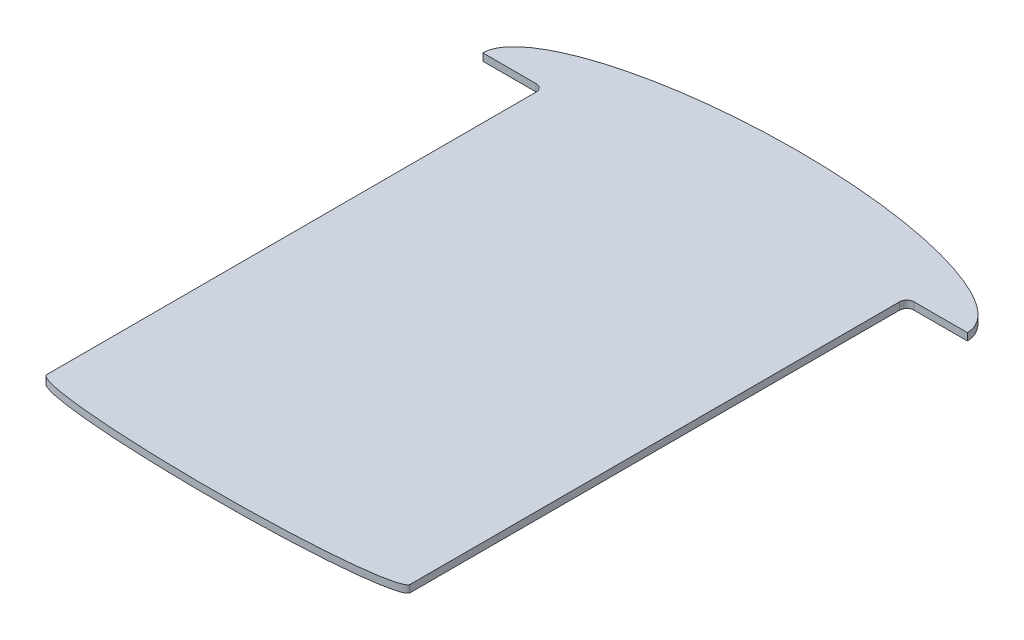
ISO-10303-21;
HEADER;
FILE_DESCRIPTION(('STEP AP214'),'2;1');
FILE_NAME('part.step','',(''),(''),'','','');
FILE_SCHEMA(('AUTOMOTIVE_DESIGN { 1 0 10303 214 1 1 1 1 }'));
ENDSEC;
DATA;
#1=APPLICATION_CONTEXT('core data for automotive mechanical design processes');
#2=APPLICATION_PROTOCOL_DEFINITION('international standard','automotive_design',2000,#1);
#3=PRODUCT_CONTEXT('',#1,'mechanical');
#4=PRODUCT('Part','Part','',(#3));
#5=PRODUCT_RELATED_PRODUCT_CATEGORY('part','',(#4));
#6=PRODUCT_DEFINITION_FORMATION('','',#4);
#7=PRODUCT_DEFINITION_CONTEXT('part definition',#1,'design');
#8=PRODUCT_DEFINITION('design','',#6,#7);
#9=PRODUCT_DEFINITION_SHAPE('','',#8);
#10=(LENGTH_UNIT() NAMED_UNIT(*) SI_UNIT(.MILLI.,.METRE.));
#11=(NAMED_UNIT(*) PLANE_ANGLE_UNIT() SI_UNIT($,.RADIAN.));
#12=(NAMED_UNIT(*) SI_UNIT($,.STERADIAN.) SOLID_ANGLE_UNIT());
#13=UNCERTAINTY_MEASURE_WITH_UNIT(LENGTH_MEASURE(1.E-05),#10,'distance_accuracy_value','');
#14=(GEOMETRIC_REPRESENTATION_CONTEXT(3) GLOBAL_UNCERTAINTY_ASSIGNED_CONTEXT((#13)) GLOBAL_UNIT_ASSIGNED_CONTEXT((#10,
#11,#12)) REPRESENTATION_CONTEXT('',''));
#15=CARTESIAN_POINT('',(0.,0.,0.));
#16=DIRECTION('',(0.,0.,1.));
#17=DIRECTION('',(1.,0.,0.));
#18=AXIS2_PLACEMENT_3D('',#15,#16,#17);
#19=CARTESIAN_POINT('',(-75.,3.,0.));
#20=DIRECTION('',(1.,0.,0.));
#21=DIRECTION('',(0.,0.,-1.));
#22=AXIS2_PLACEMENT_3D('',#19,#20,#21);
#23=PLANE('',#22);
#24=DIRECTION('',(0.,0.,1.));
#25=VECTOR('',#24,1.);
#26=CARTESIAN_POINT('',(-75.,3.,0.));
#27=LINE('',#26,#25);
#28=CARTESIAN_POINT('',(-75.,3.,-92.));
#29=VERTEX_POINT('',#28);
#30=CARTESIAN_POINT('',(-75.,3.,110.));
#31=VERTEX_POINT('',#30);
#32=EDGE_CURVE('E102',#29,#31,#27,.T.);
#33=ORIENTED_EDGE('',*,*,#32,.F.);
#34=DIRECTION('',(0.,-1.,0.));
#35=VECTOR('',#34,1.);
#36=CARTESIAN_POINT('',(-75.,0.,-92.));
#37=LINE('',#36,#35);
#38=CARTESIAN_POINT('',(-75.,0.,-92.));
#39=VERTEX_POINT('',#38);
#40=EDGE_CURVE('E136',#29,#39,#37,.T.);
#41=ORIENTED_EDGE('',*,*,#40,.T.);
#42=DIRECTION('',(0.,0.,1.));
#43=VECTOR('',#42,1.);
#44=CARTESIAN_POINT('',(-75.,0.,0.));
#45=LINE('',#44,#43);
#46=CARTESIAN_POINT('',(-75.,0.,110.));
#47=VERTEX_POINT('',#46);
#48=EDGE_CURVE('E124',#39,#47,#45,.T.);
#49=ORIENTED_EDGE('',*,*,#48,.T.);
#50=DIRECTION('',(0.,-1.,0.));
#51=VECTOR('',#50,1.);
#52=CARTESIAN_POINT('',(-75.,3.,110.));
#53=LINE('',#52,#51);
#54=EDGE_CURVE('E119',#31,#47,#53,.T.);
#55=ORIENTED_EDGE('',*,*,#54,.F.);
#56=EDGE_LOOP('',(#33,#41,#49,#55));
#57=FACE_BOUND('',#56,.T.);
#58=ADVANCED_FACE('F37',(#57),#23,.F.);
#59=CARTESIAN_POINT('',(0.,3.,110.));
#60=DIRECTION('',(0.,1.,0.));
#61=DIRECTION('',(1.,0.,0.));
#62=AXIS2_PLACEMENT_3D('',#59,#60,#61);
#63=ELLIPSE('',#62,75.,7.01096901654884);
#64=DIRECTION('',(0.,-1.,0.));
#65=VECTOR('',#64,1.);
#66=SURFACE_OF_LINEAR_EXTRUSION('',#63,#65);
#67=CARTESIAN_POINT('',(0.,0.,110.));
#68=DIRECTION('',(0.,1.,0.));
#69=DIRECTION('',(1.,0.,0.));
#70=AXIS2_PLACEMENT_3D('',#67,#68,#69);
#71=ELLIPSE('',#70,75.,7.01096901654884);
#72=CARTESIAN_POINT('',(75.,0.,110.));
#73=VERTEX_POINT('',#72);
#74=EDGE_CURVE('E164',#47,#73,#71,.T.);
#75=ORIENTED_EDGE('',*,*,#74,.T.);
#76=DIRECTION('',(0.,-1.,0.));
#77=VECTOR('',#76,1.);
#78=CARTESIAN_POINT('',(75.,3.,110.));
#79=LINE('',#78,#77);
#80=CARTESIAN_POINT('',(75.,3.,110.));
#81=VERTEX_POINT('',#80);
#82=EDGE_CURVE('E121',#81,#73,#79,.T.);
#83=ORIENTED_EDGE('',*,*,#82,.F.);
#84=EDGE_CURVE('E106',#31,#81,#63,.T.);
#85=ORIENTED_EDGE('',*,*,#84,.F.);
#86=ORIENTED_EDGE('',*,*,#54,.T.);
#87=EDGE_LOOP('',(#75,#83,#85,#86));
#88=FACE_BOUND('',#87,.T.);
#89=ADVANCED_FACE('F118',(#88),#66,.F.);
#90=CARTESIAN_POINT('',(75.,3.,0.));
#91=DIRECTION('',(1.,0.,0.));
#92=DIRECTION('',(0.,0.,-1.));
#93=AXIS2_PLACEMENT_3D('',#90,#91,#92);
#94=PLANE('',#93);
#95=DIRECTION('',(0.,0.,1.));
#96=VECTOR('',#95,1.);
#97=CARTESIAN_POINT('',(75.,0.,0.));
#98=LINE('',#97,#96);
#99=CARTESIAN_POINT('',(75.,0.,-92.));
#100=VERTEX_POINT('',#99);
#101=EDGE_CURVE('E159',#100,#73,#98,.T.);
#102=ORIENTED_EDGE('',*,*,#101,.F.);
#103=DIRECTION('',(0.,-1.,0.));
#104=VECTOR('',#103,1.);
#105=CARTESIAN_POINT('',(75.,3.,-92.));
#106=LINE('',#105,#104);
#107=CARTESIAN_POINT('',(75.,3.,-92.));
#108=VERTEX_POINT('',#107);
#109=EDGE_CURVE('E129',#100,#108,#106,.F.);
#110=ORIENTED_EDGE('',*,*,#109,.T.);
#111=DIRECTION('',(0.,0.,1.));
#112=VECTOR('',#111,1.);
#113=CARTESIAN_POINT('',(75.,3.,0.));
#114=LINE('',#113,#112);
#115=EDGE_CURVE('E122',#108,#81,#114,.T.);
#116=ORIENTED_EDGE('',*,*,#115,.T.);
#117=ORIENTED_EDGE('',*,*,#82,.T.);
#118=EDGE_LOOP('',(#102,#110,#116,#117));
#119=FACE_BOUND('',#118,.T.);
#120=ADVANCED_FACE('F163',(#119),#94,.T.);
#121=CARTESIAN_POINT('',(0.,3.,-95.));
#122=DIRECTION('',(0.,0.,-1.));
#123=DIRECTION('',(-1.,0.,0.));
#124=AXIS2_PLACEMENT_3D('',#121,#122,#123);
#125=PLANE('',#124);
#126=DIRECTION('',(1.,0.,0.));
#127=VECTOR('',#126,1.);
#128=CARTESIAN_POINT('',(0.,3.,-95.));
#129=LINE('',#128,#127);
#130=CARTESIAN_POINT('',(78.,3.,-95.));
#131=VERTEX_POINT('',#130);
#132=CARTESIAN_POINT('',(100.,3.,-95.));
#133=VERTEX_POINT('',#132);
#134=EDGE_CURVE('E144',#131,#133,#129,.T.);
#135=ORIENTED_EDGE('',*,*,#134,.F.);
#136=DIRECTION('',(0.,-1.,0.));
#137=VECTOR('',#136,1.);
#138=CARTESIAN_POINT('',(78.,3.,-95.));
#139=LINE('',#138,#137);
#140=CARTESIAN_POINT('',(78.,0.,-95.));
#141=VERTEX_POINT('',#140);
#142=EDGE_CURVE('E126',#131,#141,#139,.T.);
#143=ORIENTED_EDGE('',*,*,#142,.T.);
#144=DIRECTION('',(1.,0.,0.));
#145=VECTOR('',#144,1.);
#146=CARTESIAN_POINT('',(0.,0.,-95.));
#147=LINE('',#146,#145);
#148=CARTESIAN_POINT('',(100.,0.,-95.));
#149=VERTEX_POINT('',#148);
#150=EDGE_CURVE('E161',#141,#149,#147,.T.);
#151=ORIENTED_EDGE('',*,*,#150,.T.);
#152=DIRECTION('',(0.,-1.,0.));
#153=VECTOR('',#152,1.);
#154=CARTESIAN_POINT('',(100.,3.,-95.));
#155=LINE('',#154,#153);
#156=EDGE_CURVE('E131',#133,#149,#155,.T.);
#157=ORIENTED_EDGE('',*,*,#156,.F.);
#158=EDGE_LOOP('',(#135,#143,#151,#157));
#159=FACE_BOUND('',#158,.T.);
#160=ADVANCED_FACE('F150',(#159),#125,.F.);
#161=CARTESIAN_POINT('',(0.,3.,-95.));
#162=DIRECTION('',(0.,1.,0.));
#163=DIRECTION('',(1.,0.,0.));
#164=AXIS2_PLACEMENT_3D('',#161,#162,#163);
#165=ELLIPSE('',#164,100.,30.);
#166=DIRECTION('',(0.,-1.,0.));
#167=VECTOR('',#166,1.);
#168=SURFACE_OF_LINEAR_EXTRUSION('',#165,#167);
#169=CARTESIAN_POINT('',(0.,0.,-95.));
#170=DIRECTION('',(0.,1.,0.));
#171=DIRECTION('',(1.,0.,0.));
#172=AXIS2_PLACEMENT_3D('',#169,#170,#171);
#173=ELLIPSE('',#172,100.,30.);
#174=CARTESIAN_POINT('',(-100.,0.,-95.));
#175=VERTEX_POINT('',#174);
#176=EDGE_CURVE('E166',#149,#175,#173,.T.);
#177=ORIENTED_EDGE('',*,*,#176,.T.);
#178=DIRECTION('',(0.,-1.,0.));
#179=VECTOR('',#178,1.);
#180=CARTESIAN_POINT('',(-100.,3.,-95.));
#181=LINE('',#180,#179);
#182=CARTESIAN_POINT('',(-100.,3.,-95.));
#183=VERTEX_POINT('',#182);
#184=EDGE_CURVE('E173',#183,#175,#181,.T.);
#185=ORIENTED_EDGE('',*,*,#184,.F.);
#186=EDGE_CURVE('E154',#133,#183,#165,.T.);
#187=ORIENTED_EDGE('',*,*,#186,.F.);
#188=ORIENTED_EDGE('',*,*,#156,.T.);
#189=EDGE_LOOP('',(#177,#185,#187,#188));
#190=FACE_BOUND('',#189,.T.);
#191=ADVANCED_FACE('F177',(#190),#168,.F.);
#192=CARTESIAN_POINT('',(0.,3.,-95.));
#193=DIRECTION('',(0.,0.,-1.));
#194=DIRECTION('',(-1.,0.,0.));
#195=AXIS2_PLACEMENT_3D('',#192,#193,#194);
#196=PLANE('',#195);
#197=DIRECTION('',(1.,0.,0.));
#198=VECTOR('',#197,1.);
#199=CARTESIAN_POINT('',(0.,0.,-95.));
#200=LINE('',#199,#198);
#201=CARTESIAN_POINT('',(-78.,0.,-95.));
#202=VERTEX_POINT('',#201);
#203=EDGE_CURVE('E113',#175,#202,#200,.T.);
#204=ORIENTED_EDGE('',*,*,#203,.T.);
#205=DIRECTION('',(0.,-1.,0.));
#206=VECTOR('',#205,1.);
#207=CARTESIAN_POINT('',(-78.,3.,-95.));
#208=LINE('',#207,#206);
#209=CARTESIAN_POINT('',(-78.,3.,-95.));
#210=VERTEX_POINT('',#209);
#211=EDGE_CURVE('E52',#202,#210,#208,.F.);
#212=ORIENTED_EDGE('',*,*,#211,.T.);
#213=DIRECTION('',(1.,0.,0.));
#214=VECTOR('',#213,1.);
#215=CARTESIAN_POINT('',(0.,3.,-95.));
#216=LINE('',#215,#214);
#217=EDGE_CURVE('E175',#183,#210,#216,.T.);
#218=ORIENTED_EDGE('',*,*,#217,.F.);
#219=ORIENTED_EDGE('',*,*,#184,.T.);
#220=EDGE_LOOP('',(#204,#212,#218,#219));
#221=FACE_BOUND('',#220,.T.);
#222=ADVANCED_FACE('F179',(#221),#196,.F.);
#223=CARTESIAN_POINT('',(0.,3.,0.));
#224=DIRECTION('',(0.,1.,0.));
#225=DIRECTION('',(0.,0.,1.));
#226=AXIS2_PLACEMENT_3D('',#223,#224,#225);
#227=PLANE('',#226);
#228=ORIENTED_EDGE('',*,*,#217,.T.);
#229=CARTESIAN_POINT('',(-78.,3.,-92.));
#230=DIRECTION('',(0.,1.,0.));
#231=DIRECTION('',(0.,0.,1.));
#232=AXIS2_PLACEMENT_3D('',#229,#230,#231);
#233=CIRCLE('',#232,3.);
#234=EDGE_CURVE('E11',#210,#29,#233,.F.);
#235=ORIENTED_EDGE('',*,*,#234,.T.);
#236=ORIENTED_EDGE('',*,*,#32,.T.);
#237=ORIENTED_EDGE('',*,*,#84,.T.);
#238=ORIENTED_EDGE('',*,*,#115,.F.);
#239=CARTESIAN_POINT('',(78.,3.,-92.));
#240=DIRECTION('',(0.,1.,0.));
#241=DIRECTION('',(0.,0.,1.));
#242=AXIS2_PLACEMENT_3D('',#239,#240,#241);
#243=CIRCLE('',#242,3.);
#244=EDGE_CURVE('E141',#108,#131,#243,.F.);
#245=ORIENTED_EDGE('',*,*,#244,.T.);
#246=ORIENTED_EDGE('',*,*,#134,.T.);
#247=ORIENTED_EDGE('',*,*,#186,.T.);
#248=EDGE_LOOP('',(#228,#235,#236,#237,#238,#245,#246,#247));
#249=FACE_BOUND('',#248,.T.);
#250=ADVANCED_FACE('F104',(#249),#227,.T.);
#251=CARTESIAN_POINT('',(0.,0.,0.));
#252=DIRECTION('',(0.,1.,0.));
#253=DIRECTION('',(0.,0.,1.));
#254=AXIS2_PLACEMENT_3D('',#251,#252,#253);
#255=PLANE('',#254);
#256=ORIENTED_EDGE('',*,*,#48,.F.);
#257=CARTESIAN_POINT('',(-78.,0.,-92.));
#258=DIRECTION('',(0.,1.,0.));
#259=DIRECTION('',(0.,0.,1.));
#260=AXIS2_PLACEMENT_3D('',#257,#258,#259);
#261=CIRCLE('',#260,3.);
#262=EDGE_CURVE('E45',#39,#202,#261,.T.);
#263=ORIENTED_EDGE('',*,*,#262,.T.);
#264=ORIENTED_EDGE('',*,*,#203,.F.);
#265=ORIENTED_EDGE('',*,*,#176,.F.);
#266=ORIENTED_EDGE('',*,*,#150,.F.);
#267=CARTESIAN_POINT('',(78.,0.,-92.));
#268=DIRECTION('',(0.,1.,0.));
#269=DIRECTION('',(0.,0.,1.));
#270=AXIS2_PLACEMENT_3D('',#267,#268,#269);
#271=CIRCLE('',#270,3.);
#272=EDGE_CURVE('E139',#141,#100,#271,.T.);
#273=ORIENTED_EDGE('',*,*,#272,.T.);
#274=ORIENTED_EDGE('',*,*,#101,.T.);
#275=ORIENTED_EDGE('',*,*,#74,.F.);
#276=EDGE_LOOP('',(#256,#263,#264,#265,#266,#273,#274,#275));
#277=FACE_BOUND('',#276,.T.);
#278=ADVANCED_FACE('F158',(#277),#255,.F.);
#279=CARTESIAN_POINT('',(78.,3.,-92.));
#280=DIRECTION('',(0.,-1.,0.));
#281=DIRECTION('',(0.,0.,-1.));
#282=AXIS2_PLACEMENT_3D('',#279,#280,#281);
#283=CYLINDRICAL_SURFACE('',#282,3.);
#284=ORIENTED_EDGE('',*,*,#244,.F.);
#285=ORIENTED_EDGE('',*,*,#109,.F.);
#286=ORIENTED_EDGE('',*,*,#272,.F.);
#287=ORIENTED_EDGE('',*,*,#142,.F.);
#288=EDGE_LOOP('',(#284,#285,#286,#287));
#289=FACE_BOUND('',#288,.T.);
#290=ADVANCED_FACE('F156',(#289),#283,.F.);
#291=CARTESIAN_POINT('',(-78.,3.,-92.));
#292=DIRECTION('',(0.,1.,0.));
#293=DIRECTION('',(0.,0.,1.));
#294=AXIS2_PLACEMENT_3D('',#291,#292,#293);
#295=CYLINDRICAL_SURFACE('',#294,3.);
#296=ORIENTED_EDGE('',*,*,#234,.F.);
#297=ORIENTED_EDGE('',*,*,#211,.F.);
#298=ORIENTED_EDGE('',*,*,#262,.F.);
#299=ORIENTED_EDGE('',*,*,#40,.F.);
#300=EDGE_LOOP('',(#296,#297,#298,#299));
#301=FACE_BOUND('',#300,.T.);
#302=ADVANCED_FACE('F39',(#301),#295,.F.);
#303=CLOSED_SHELL('',(#58,#89,#120,#160,#191,#222,#250,#278,#290,#302));
#304=MANIFOLD_SOLID_BREP('B2',#303);
#305=ADVANCED_BREP_SHAPE_REPRESENTATION('',(#18,#304),#14);
#306=SHAPE_DEFINITION_REPRESENTATION(#9,#305);
ENDSEC;
END-ISO-10303-21;
